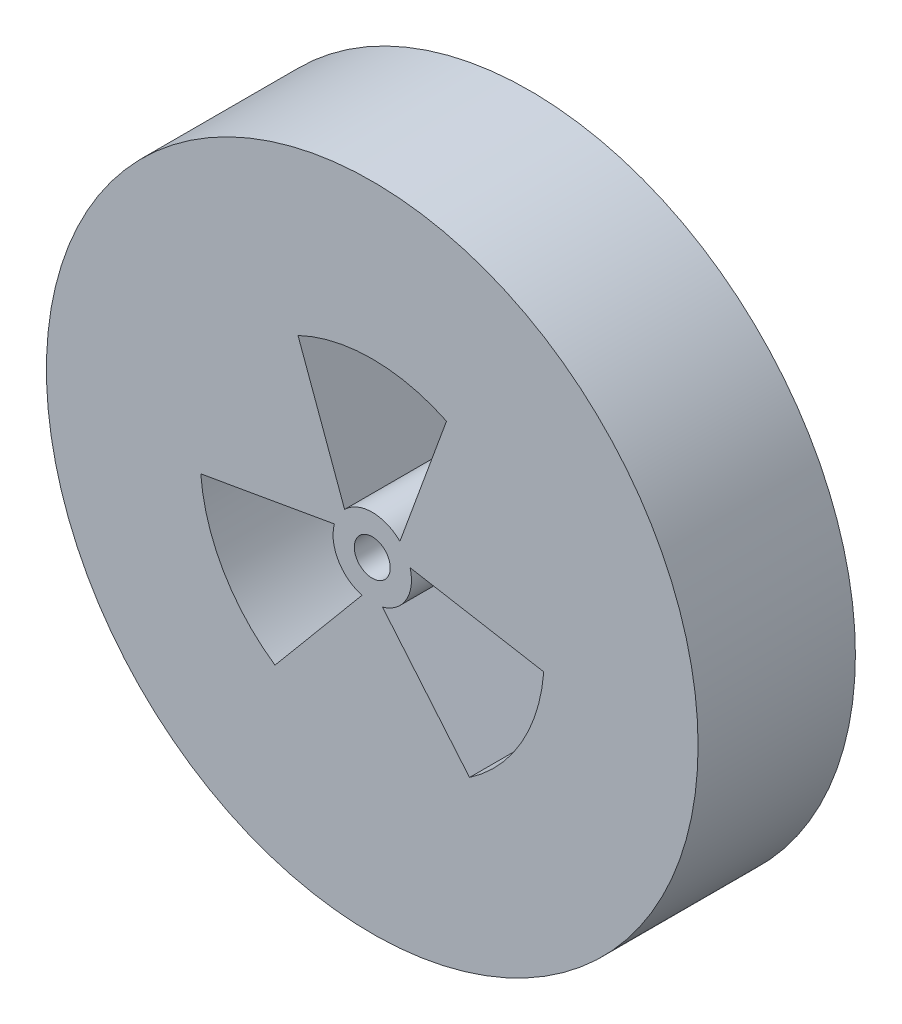
ISO-10303-21;
HEADER;
FILE_DESCRIPTION(('STEP AP214'),'2;1');
FILE_NAME('part.step','',(''),(''),'','','');
FILE_SCHEMA(('AUTOMOTIVE_DESIGN { 1 0 10303 214 1 1 1 1 }'));
ENDSEC;
DATA;
#1=APPLICATION_CONTEXT('core data for automotive mechanical design processes');
#2=APPLICATION_PROTOCOL_DEFINITION('international standard','automotive_design',2000,#1);
#3=PRODUCT_CONTEXT('',#1,'mechanical');
#4=PRODUCT('Part','Part','',(#3));
#5=PRODUCT_RELATED_PRODUCT_CATEGORY('part','',(#4));
#6=PRODUCT_DEFINITION_FORMATION('','',#4);
#7=PRODUCT_DEFINITION_CONTEXT('part definition',#1,'design');
#8=PRODUCT_DEFINITION('design','',#6,#7);
#9=PRODUCT_DEFINITION_SHAPE('','',#8);
#10=(LENGTH_UNIT() NAMED_UNIT(*) SI_UNIT(.MILLI.,.METRE.));
#11=(NAMED_UNIT(*) PLANE_ANGLE_UNIT() SI_UNIT($,.RADIAN.));
#12=(NAMED_UNIT(*) SI_UNIT($,.STERADIAN.) SOLID_ANGLE_UNIT());
#13=UNCERTAINTY_MEASURE_WITH_UNIT(LENGTH_MEASURE(1.E-05),#10,'distance_accuracy_value','');
#14=(GEOMETRIC_REPRESENTATION_CONTEXT(3) GLOBAL_UNCERTAINTY_ASSIGNED_CONTEXT((#13)) GLOBAL_UNIT_ASSIGNED_CONTEXT((#10,
#11,#12)) REPRESENTATION_CONTEXT('',''));
#15=CARTESIAN_POINT('',(0.,0.,0.));
#16=DIRECTION('',(0.,0.,1.));
#17=DIRECTION('',(1.,0.,0.));
#18=AXIS2_PLACEMENT_3D('',#15,#16,#17);
#19=CARTESIAN_POINT('',(0.,0.,35.));
#20=DIRECTION('',(0.,0.,1.));
#21=DIRECTION('',(1.,0.,0.));
#22=AXIS2_PLACEMENT_3D('',#19,#20,#21);
#23=PLANE('',#22);
#24=CARTESIAN_POINT('',(0.,0.,35.));
#25=DIRECTION('',(0.,0.,1.));
#26=DIRECTION('',(1.,0.,0.));
#27=AXIS2_PLACEMENT_3D('',#24,#25,#26);
#28=CIRCLE('',#27,72.5);
#29=CARTESIAN_POINT('',(72.5,0.,35.));
#30=VERTEX_POINT('',#29);
#31=EDGE_CURVE('E11',#30,#30,#28,.T.);
#32=ORIENTED_EDGE('',*,*,#31,.T.);
#33=EDGE_LOOP('',(#32));
#34=FACE_BOUND('',#33,.T.);
#35=CARTESIAN_POINT('',(0.,0.,35.));
#36=DIRECTION('',(0.,0.,1.));
#37=DIRECTION('',(1.,0.,0.));
#38=AXIS2_PLACEMENT_3D('',#35,#36,#37);
#39=CIRCLE('',#38,4.);
#40=CARTESIAN_POINT('',(4.,0.,35.));
#41=VERTEX_POINT('',#40);
#42=EDGE_CURVE('E120',#41,#41,#39,.T.);
#43=ORIENTED_EDGE('',*,*,#42,.F.);
#44=EDGE_LOOP('',(#43));
#45=FACE_BOUND('',#44,.T.);
#46=DIRECTION('',(-0.343414958043601,-0.939183776793398,0.));
#47=VECTOR('',#46,1.);
#48=CARTESIAN_POINT('',(6.15529830273519,6.18073022841704,35.));
#49=LINE('',#48,#47);
#50=CARTESIAN_POINT('',(16.5189630462717,34.5236592921516,35.));
#51=VERTEX_POINT('',#50);
#52=CARTESIAN_POINT('',(6.15529830273519,6.18073022841704,35.));
#53=VERTEX_POINT('',#52);
#54=EDGE_CURVE('E84',#51,#53,#49,.T.);
#55=ORIENTED_EDGE('',*,*,#54,.T.);
#56=CARTESIAN_POINT('',(0.,0.,35.));
#57=DIRECTION('',(0.,0.,-1.));
#58=DIRECTION('',(-1.,0.,0.));
#59=AXIS2_PLACEMENT_3D('',#56,#57,#58);
#60=CIRCLE('',#59,8.72290796421256);
#61=CARTESIAN_POINT('',(-6.15529830273519,6.18073022841704,35.));
#62=VERTEX_POINT('',#61);
#63=EDGE_CURVE('E86',#62,#53,#60,.T.);
#64=ORIENTED_EDGE('',*,*,#63,.F.);
#65=DIRECTION('',(0.343414958043601,-0.939183776793398,0.));
#66=VECTOR('',#65,1.);
#67=CARTESIAN_POINT('',(-6.15529830273519,6.18073022841704,35.));
#68=LINE('',#67,#66);
#69=CARTESIAN_POINT('',(-16.5189630462717,34.5236592921516,35.));
#70=VERTEX_POINT('',#69);
#71=EDGE_CURVE('E85',#70,#62,#68,.T.);
#72=ORIENTED_EDGE('',*,*,#71,.F.);
#73=CARTESIAN_POINT('',(0.,0.,35.));
#74=DIRECTION('',(0.,0.,1.));
#75=DIRECTION('',(-1.,0.,0.));
#76=AXIS2_PLACEMENT_3D('',#73,#74,#75);
#77=CIRCLE('',#76,38.2721725414779);
#78=EDGE_CURVE('E63',#51,#70,#77,.T.);
#79=ORIENTED_EDGE('',*,*,#78,.F.);
#80=EDGE_LOOP('',(#55,#64,#72,#79));
#81=FACE_BOUND('',#80,.T.);
#82=DIRECTION('',(-0.641649530503493,0.766997966102027,0.));
#83=VECTOR('',#82,1.);
#84=CARTESIAN_POINT('',(2.27502024037992,-8.42100981224845,35.));
#85=LINE('',#84,#83);
#86=CARTESIAN_POINT('',(21.638884455466,-31.5676712883235,35.));
#87=VERTEX_POINT('',#86);
#88=CARTESIAN_POINT('',(2.27502024037992,-8.42100981224845,35.));
#89=VERTEX_POINT('',#88);
#90=EDGE_CURVE('E202',#87,#89,#85,.T.);
#91=ORIENTED_EDGE('',*,*,#90,.T.);
#92=CARTESIAN_POINT('',(0.,0.,35.));
#93=DIRECTION('',(0.,0.,-1.));
#94=DIRECTION('',(0.500000000000004,0.866025403784436,0.));
#95=AXIS2_PLACEMENT_3D('',#92,#93,#94);
#96=CIRCLE('',#95,8.72290796421256);
#97=CARTESIAN_POINT('',(8.43031854311516,2.24027958383136,35.));
#98=VERTEX_POINT('',#97);
#99=EDGE_CURVE('E220',#98,#89,#96,.T.);
#100=ORIENTED_EDGE('',*,*,#99,.F.);
#101=DIRECTION('',(-0.985064488547097,0.172185810691379,0.));
#102=VECTOR('',#101,1.);
#103=CARTESIAN_POINT('',(8.43031854311516,2.24027958383136,35.));
#104=LINE('',#103,#102);
#105=CARTESIAN_POINT('',(38.1578475017378,-2.95598800382836,35.));
#106=VERTEX_POINT('',#105);
#107=EDGE_CURVE('E214',#106,#98,#104,.T.);
#108=ORIENTED_EDGE('',*,*,#107,.F.);
#109=CARTESIAN_POINT('',(0.,0.,35.));
#110=DIRECTION('',(0.,0.,1.));
#111=DIRECTION('',(0.500000000000004,0.866025403784436,0.));
#112=AXIS2_PLACEMENT_3D('',#109,#110,#111);
#113=CIRCLE('',#112,38.2721725414779);
#114=EDGE_CURVE('E223',#87,#106,#113,.T.);
#115=ORIENTED_EDGE('',*,*,#114,.F.);
#116=EDGE_LOOP('',(#91,#100,#108,#115));
#117=FACE_BOUND('',#116,.T.);
#118=DIRECTION('',(0.985064488547099,0.172185810691365,0.));
#119=VECTOR('',#118,1.);
#120=CARTESIAN_POINT('',(-8.43031854311513,2.24027958383147,35.));
#121=LINE('',#120,#119);
#122=CARTESIAN_POINT('',(-38.1578475017379,-2.95598800382782,35.));
#123=VERTEX_POINT('',#122);
#124=CARTESIAN_POINT('',(-8.43031854311513,2.24027958383147,35.));
#125=VERTEX_POINT('',#124);
#126=EDGE_CURVE('E188',#123,#125,#121,.T.);
#127=ORIENTED_EDGE('',*,*,#126,.T.);
#128=CARTESIAN_POINT('',(0.,0.,35.));
#129=DIRECTION('',(0.,0.,-1.));
#130=DIRECTION('',(0.499999999999992,-0.866025403784443,0.));
#131=AXIS2_PLACEMENT_3D('',#128,#129,#130);
#132=CIRCLE('',#131,8.72290796421256);
#133=CARTESIAN_POINT('',(-2.27502024038004,-8.42100981224842,35.));
#134=VERTEX_POINT('',#133);
#135=EDGE_CURVE('E193',#134,#125,#132,.T.);
#136=ORIENTED_EDGE('',*,*,#135,.F.);
#137=DIRECTION('',(0.641649530503504,0.766997966102018,0.));
#138=VECTOR('',#137,1.);
#139=CARTESIAN_POINT('',(-2.27502024038004,-8.42100981224842,35.));
#140=LINE('',#139,#138);
#141=CARTESIAN_POINT('',(-21.6388844554665,-31.5676712883232,35.));
#142=VERTEX_POINT('',#141);
#143=EDGE_CURVE('E176',#142,#134,#140,.T.);
#144=ORIENTED_EDGE('',*,*,#143,.F.);
#145=CARTESIAN_POINT('',(0.,0.,35.));
#146=DIRECTION('',(0.,0.,1.));
#147=DIRECTION('',(0.499999999999992,-0.866025403784443,0.));
#148=AXIS2_PLACEMENT_3D('',#145,#146,#147);
#149=CIRCLE('',#148,38.2721725414779);
#150=EDGE_CURVE('E235',#123,#142,#149,.T.);
#151=ORIENTED_EDGE('',*,*,#150,.F.);
#152=EDGE_LOOP('',(#127,#136,#144,#151));
#153=FACE_BOUND('',#152,.T.);
#154=ADVANCED_FACE('F34',(#34,#45,#81,#117,#153),#23,.T.);
#155=CARTESIAN_POINT('',(0.,0.,0.));
#156=DIRECTION('',(0.,0.,1.));
#157=DIRECTION('',(1.,0.,0.));
#158=AXIS2_PLACEMENT_3D('',#155,#156,#157);
#159=PLANE('',#158);
#160=CARTESIAN_POINT('',(0.,0.,0.));
#161=DIRECTION('',(0.,0.,-1.));
#162=DIRECTION('',(0.500000000000004,0.866025403784436,0.));
#163=AXIS2_PLACEMENT_3D('',#160,#161,#162);
#164=CIRCLE('',#163,8.72290796421256);
#165=CARTESIAN_POINT('',(8.43031854311516,2.24027958383136,0.));
#166=VERTEX_POINT('',#165);
#167=CARTESIAN_POINT('',(2.27502024037992,-8.42100981224845,0.));
#168=VERTEX_POINT('',#167);
#169=EDGE_CURVE('E210',#166,#168,#164,.T.);
#170=ORIENTED_EDGE('',*,*,#169,.T.);
#171=DIRECTION('',(-0.641649530503493,0.766997966102027,0.));
#172=VECTOR('',#171,1.);
#173=CARTESIAN_POINT('',(2.27502024037992,-8.42100981224845,0.));
#174=LINE('',#173,#172);
#175=CARTESIAN_POINT('',(21.638884455466,-31.5676712883235,0.));
#176=VERTEX_POINT('',#175);
#177=EDGE_CURVE('E198',#176,#168,#174,.T.);
#178=ORIENTED_EDGE('',*,*,#177,.F.);
#179=CARTESIAN_POINT('',(0.,0.,0.));
#180=DIRECTION('',(0.,0.,1.));
#181=DIRECTION('',(0.500000000000004,0.866025403784436,0.));
#182=AXIS2_PLACEMENT_3D('',#179,#180,#181);
#183=CIRCLE('',#182,38.2721725414779);
#184=CARTESIAN_POINT('',(38.1578475017378,-2.95598800382836,0.));
#185=VERTEX_POINT('',#184);
#186=EDGE_CURVE('E213',#176,#185,#183,.T.);
#187=ORIENTED_EDGE('',*,*,#186,.T.);
#188=DIRECTION('',(-0.985064488547097,0.172185810691379,0.));
#189=VECTOR('',#188,1.);
#190=CARTESIAN_POINT('',(8.43031854311516,2.24027958383136,0.));
#191=LINE('',#190,#189);
#192=EDGE_CURVE('E217',#185,#166,#191,.T.);
#193=ORIENTED_EDGE('',*,*,#192,.T.);
#194=EDGE_LOOP('',(#170,#178,#187,#193));
#195=FACE_BOUND('',#194,.T.);
#196=CARTESIAN_POINT('',(0.,0.,0.));
#197=DIRECTION('',(0.,0.,1.));
#198=DIRECTION('',(1.,0.,0.));
#199=AXIS2_PLACEMENT_3D('',#196,#197,#198);
#200=CIRCLE('',#199,4.);
#201=CARTESIAN_POINT('',(4.,0.,0.));
#202=VERTEX_POINT('',#201);
#203=EDGE_CURVE('E118',#202,#202,#200,.T.);
#204=ORIENTED_EDGE('',*,*,#203,.T.);
#205=EDGE_LOOP('',(#204));
#206=FACE_BOUND('',#205,.T.);
#207=CARTESIAN_POINT('',(0.,0.,0.));
#208=DIRECTION('',(0.,0.,1.));
#209=DIRECTION('',(1.,0.,0.));
#210=AXIS2_PLACEMENT_3D('',#207,#208,#209);
#211=CIRCLE('',#210,72.5);
#212=CARTESIAN_POINT('',(72.5,0.,0.));
#213=VERTEX_POINT('',#212);
#214=EDGE_CURVE('E38',#213,#213,#211,.T.);
#215=ORIENTED_EDGE('',*,*,#214,.F.);
#216=EDGE_LOOP('',(#215));
#217=FACE_BOUND('',#216,.T.);
#218=CARTESIAN_POINT('',(0.,0.,0.));
#219=DIRECTION('',(0.,0.,-1.));
#220=DIRECTION('',(-1.,0.,0.));
#221=AXIS2_PLACEMENT_3D('',#218,#219,#220);
#222=CIRCLE('',#221,8.72290796421256);
#223=CARTESIAN_POINT('',(-6.15529830273519,6.18073022841704,0.));
#224=VERTEX_POINT('',#223);
#225=CARTESIAN_POINT('',(6.15529830273519,6.18073022841704,0.));
#226=VERTEX_POINT('',#225);
#227=EDGE_CURVE('E108',#224,#226,#222,.T.);
#228=ORIENTED_EDGE('',*,*,#227,.T.);
#229=DIRECTION('',(-0.343414958043601,-0.939183776793398,0.));
#230=VECTOR('',#229,1.);
#231=CARTESIAN_POINT('',(6.15529830273519,6.18073022841704,0.));
#232=LINE('',#231,#230);
#233=CARTESIAN_POINT('',(16.5189630462717,34.5236592921516,0.));
#234=VERTEX_POINT('',#233);
#235=EDGE_CURVE('E98',#234,#226,#232,.T.);
#236=ORIENTED_EDGE('',*,*,#235,.F.);
#237=CARTESIAN_POINT('',(0.,0.,0.));
#238=DIRECTION('',(0.,0.,1.));
#239=DIRECTION('',(-1.,0.,0.));
#240=AXIS2_PLACEMENT_3D('',#237,#238,#239);
#241=CIRCLE('',#240,38.2721725414779);
#242=CARTESIAN_POINT('',(-16.5189630462717,34.5236592921516,0.));
#243=VERTEX_POINT('',#242);
#244=EDGE_CURVE('E68',#234,#243,#241,.T.);
#245=ORIENTED_EDGE('',*,*,#244,.T.);
#246=DIRECTION('',(0.343414958043601,-0.939183776793398,0.));
#247=VECTOR('',#246,1.);
#248=CARTESIAN_POINT('',(-6.15529830273519,6.18073022841704,0.));
#249=LINE('',#248,#247);
#250=EDGE_CURVE('E111',#243,#224,#249,.T.);
#251=ORIENTED_EDGE('',*,*,#250,.T.);
#252=EDGE_LOOP('',(#228,#236,#245,#251));
#253=FACE_BOUND('',#252,.T.);
#254=CARTESIAN_POINT('',(0.,0.,0.));
#255=DIRECTION('',(0.,0.,-1.));
#256=DIRECTION('',(0.499999999999992,-0.866025403784443,0.));
#257=AXIS2_PLACEMENT_3D('',#254,#255,#256);
#258=CIRCLE('',#257,8.72290796421256);
#259=CARTESIAN_POINT('',(-2.27502024038004,-8.42100981224842,0.));
#260=VERTEX_POINT('',#259);
#261=CARTESIAN_POINT('',(-8.43031854311513,2.24027958383147,0.));
#262=VERTEX_POINT('',#261);
#263=EDGE_CURVE('E162',#260,#262,#258,.T.);
#264=ORIENTED_EDGE('',*,*,#263,.T.);
#265=DIRECTION('',(0.985064488547099,0.172185810691365,0.));
#266=VECTOR('',#265,1.);
#267=CARTESIAN_POINT('',(-8.43031854311513,2.24027958383147,0.));
#268=LINE('',#267,#266);
#269=CARTESIAN_POINT('',(-38.1578475017379,-2.95598800382782,0.));
#270=VERTEX_POINT('',#269);
#271=EDGE_CURVE('E166',#270,#262,#268,.T.);
#272=ORIENTED_EDGE('',*,*,#271,.F.);
#273=CARTESIAN_POINT('',(0.,0.,0.));
#274=DIRECTION('',(0.,0.,1.));
#275=DIRECTION('',(0.499999999999992,-0.866025403784443,0.));
#276=AXIS2_PLACEMENT_3D('',#273,#274,#275);
#277=CIRCLE('',#276,38.2721725414779);
#278=CARTESIAN_POINT('',(-21.6388844554665,-31.5676712883232,0.));
#279=VERTEX_POINT('',#278);
#280=EDGE_CURVE('E175',#270,#279,#277,.T.);
#281=ORIENTED_EDGE('',*,*,#280,.T.);
#282=DIRECTION('',(0.641649530503504,0.766997966102018,0.));
#283=VECTOR('',#282,1.);
#284=CARTESIAN_POINT('',(-2.27502024038004,-8.42100981224842,0.));
#285=LINE('',#284,#283);
#286=EDGE_CURVE('E169',#279,#260,#285,.T.);
#287=ORIENTED_EDGE('',*,*,#286,.T.);
#288=EDGE_LOOP('',(#264,#272,#281,#287));
#289=FACE_BOUND('',#288,.T.);
#290=ADVANCED_FACE('F126',(#195,#206,#217,#253,#289),#159,.F.);
#291=CARTESIAN_POINT('',(0.,0.,35.));
#292=DIRECTION('',(0.,0.,-1.));
#293=DIRECTION('',(-1.,0.,0.));
#294=AXIS2_PLACEMENT_3D('',#291,#292,#293);
#295=CYLINDRICAL_SURFACE('',#294,72.5);
#296=ORIENTED_EDGE('',*,*,#31,.F.);
#297=EDGE_LOOP('',(#296));
#298=FACE_BOUND('',#297,.T.);
#299=ORIENTED_EDGE('',*,*,#214,.T.);
#300=EDGE_LOOP('',(#299));
#301=FACE_BOUND('',#300,.T.);
#302=ADVANCED_FACE('F36',(#298,#301),#295,.T.);
#303=CARTESIAN_POINT('',(0.,0.,35.));
#304=DIRECTION('',(0.,0.,-1.));
#305=DIRECTION('',(-1.,0.,0.));
#306=AXIS2_PLACEMENT_3D('',#303,#304,#305);
#307=CYLINDRICAL_SURFACE('',#306,4.);
#308=ORIENTED_EDGE('',*,*,#42,.T.);
#309=EDGE_LOOP('',(#308));
#310=FACE_BOUND('',#309,.T.);
#311=ORIENTED_EDGE('',*,*,#203,.F.);
#312=EDGE_LOOP('',(#311));
#313=FACE_BOUND('',#312,.T.);
#314=ADVANCED_FACE('F129',(#310,#313),#307,.F.);
#315=CARTESIAN_POINT('',(0.,0.,0.));
#316=DIRECTION('',(0.,0.,1.));
#317=DIRECTION('',(1.,0.,0.));
#318=AXIS2_PLACEMENT_3D('',#315,#316,#317);
#319=CYLINDRICAL_SURFACE('',#318,8.72290796421256);
#320=DIRECTION('',(0.,0.,1.));
#321=VECTOR('',#320,1.);
#322=CARTESIAN_POINT('',(6.15529830273519,6.18073022841704,0.));
#323=LINE('',#322,#321);
#324=EDGE_CURVE('E93',#226,#53,#323,.T.);
#325=ORIENTED_EDGE('',*,*,#324,.F.);
#326=ORIENTED_EDGE('',*,*,#227,.F.);
#327=DIRECTION('',(0.,0.,1.));
#328=VECTOR('',#327,1.);
#329=CARTESIAN_POINT('',(-6.15529830273519,6.18073022841704,0.));
#330=LINE('',#329,#328);
#331=EDGE_CURVE('E51',#224,#62,#330,.T.);
#332=ORIENTED_EDGE('',*,*,#331,.T.);
#333=ORIENTED_EDGE('',*,*,#63,.T.);
#334=EDGE_LOOP('',(#325,#326,#332,#333));
#335=FACE_BOUND('',#334,.T.);
#336=ADVANCED_FACE('F131',(#335),#319,.T.);
#337=CARTESIAN_POINT('',(-6.15529830273519,6.18073022841704,0.));
#338=DIRECTION('',(-0.939183776793398,-0.343414958043601,0.));
#339=DIRECTION('',(0.343414958043601,-0.939183776793398,0.));
#340=AXIS2_PLACEMENT_3D('',#337,#338,#339);
#341=PLANE('',#340);
#342=ORIENTED_EDGE('',*,*,#71,.T.);
#343=ORIENTED_EDGE('',*,*,#331,.F.);
#344=ORIENTED_EDGE('',*,*,#250,.F.);
#345=DIRECTION('',(0.,0.,1.));
#346=VECTOR('',#345,1.);
#347=CARTESIAN_POINT('',(-16.5189630462717,34.5236592921516,0.));
#348=LINE('',#347,#346);
#349=EDGE_CURVE('E114',#243,#70,#348,.T.);
#350=ORIENTED_EDGE('',*,*,#349,.T.);
#351=EDGE_LOOP('',(#342,#343,#344,#350));
#352=FACE_BOUND('',#351,.T.);
#353=ADVANCED_FACE('F138',(#352),#341,.F.);
#354=CARTESIAN_POINT('',(0.,0.,0.));
#355=DIRECTION('',(0.,0.,1.));
#356=DIRECTION('',(1.,0.,0.));
#357=AXIS2_PLACEMENT_3D('',#354,#355,#356);
#358=CYLINDRICAL_SURFACE('',#357,38.2721725414779);
#359=ORIENTED_EDGE('',*,*,#78,.T.);
#360=ORIENTED_EDGE('',*,*,#349,.F.);
#361=ORIENTED_EDGE('',*,*,#244,.F.);
#362=DIRECTION('',(0.,0.,1.));
#363=VECTOR('',#362,1.);
#364=CARTESIAN_POINT('',(16.5189630462717,34.5236592921516,0.));
#365=LINE('',#364,#363);
#366=EDGE_CURVE('E88',#234,#51,#365,.T.);
#367=ORIENTED_EDGE('',*,*,#366,.T.);
#368=EDGE_LOOP('',(#359,#360,#361,#367));
#369=FACE_BOUND('',#368,.T.);
#370=ADVANCED_FACE('F89',(#369),#358,.F.);
#371=CARTESIAN_POINT('',(6.15529830273519,6.18073022841704,0.));
#372=DIRECTION('',(-0.939183776793398,0.343414958043601,0.));
#373=DIRECTION('',(-0.343414958043601,-0.939183776793398,0.));
#374=AXIS2_PLACEMENT_3D('',#371,#372,#373);
#375=PLANE('',#374);
#376=ORIENTED_EDGE('',*,*,#54,.F.);
#377=ORIENTED_EDGE('',*,*,#366,.F.);
#378=ORIENTED_EDGE('',*,*,#235,.T.);
#379=ORIENTED_EDGE('',*,*,#324,.T.);
#380=EDGE_LOOP('',(#376,#377,#378,#379));
#381=FACE_BOUND('',#380,.T.);
#382=ADVANCED_FACE('F96',(#381),#375,.T.);
#383=CARTESIAN_POINT('',(0.,0.,0.));
#384=DIRECTION('',(0.,0.,1.));
#385=DIRECTION('',(1.,0.,0.));
#386=AXIS2_PLACEMENT_3D('',#383,#384,#385);
#387=CYLINDRICAL_SURFACE('',#386,8.72290796421256);
#388=ORIENTED_EDGE('',*,*,#135,.T.);
#389=DIRECTION('',(0.,0.,1.));
#390=VECTOR('',#389,1.);
#391=CARTESIAN_POINT('',(-8.43031854311513,2.24027958383147,0.));
#392=LINE('',#391,#390);
#393=EDGE_CURVE('E184',#262,#125,#392,.T.);
#394=ORIENTED_EDGE('',*,*,#393,.F.);
#395=ORIENTED_EDGE('',*,*,#263,.F.);
#396=DIRECTION('',(0.,0.,1.));
#397=VECTOR('',#396,1.);
#398=CARTESIAN_POINT('',(-2.27502024038004,-8.42100981224842,0.));
#399=LINE('',#398,#397);
#400=EDGE_CURVE('E224',#260,#134,#399,.T.);
#401=ORIENTED_EDGE('',*,*,#400,.T.);
#402=EDGE_LOOP('',(#388,#394,#395,#401));
#403=FACE_BOUND('',#402,.T.);
#404=ADVANCED_FACE('F191',(#403),#387,.T.);
#405=CARTESIAN_POINT('',(-2.27502024038004,-8.42100981224842,0.));
#406=DIRECTION('',(0.766997966102019,-0.641649530503504,0.));
#407=DIRECTION('',(0.641649530503504,0.766997966102019,0.));
#408=AXIS2_PLACEMENT_3D('',#405,#406,#407);
#409=PLANE('',#408);
#410=ORIENTED_EDGE('',*,*,#143,.T.);
#411=ORIENTED_EDGE('',*,*,#400,.F.);
#412=ORIENTED_EDGE('',*,*,#286,.F.);
#413=DIRECTION('',(0.,0.,1.));
#414=VECTOR('',#413,1.);
#415=CARTESIAN_POINT('',(-21.6388844554665,-31.5676712883232,0.));
#416=LINE('',#415,#414);
#417=EDGE_CURVE('E233',#279,#142,#416,.T.);
#418=ORIENTED_EDGE('',*,*,#417,.T.);
#419=EDGE_LOOP('',(#410,#411,#412,#418));
#420=FACE_BOUND('',#419,.T.);
#421=ADVANCED_FACE('F244',(#420),#409,.F.);
#422=CARTESIAN_POINT('',(0.,0.,0.));
#423=DIRECTION('',(0.,0.,1.));
#424=DIRECTION('',(1.,0.,0.));
#425=AXIS2_PLACEMENT_3D('',#422,#423,#424);
#426=CYLINDRICAL_SURFACE('',#425,38.2721725414779);
#427=ORIENTED_EDGE('',*,*,#150,.T.);
#428=ORIENTED_EDGE('',*,*,#417,.F.);
#429=ORIENTED_EDGE('',*,*,#280,.F.);
#430=DIRECTION('',(0.,0.,1.));
#431=VECTOR('',#430,1.);
#432=CARTESIAN_POINT('',(-38.1578475017379,-2.95598800382782,0.));
#433=LINE('',#432,#431);
#434=EDGE_CURVE('E187',#270,#123,#433,.T.);
#435=ORIENTED_EDGE('',*,*,#434,.T.);
#436=EDGE_LOOP('',(#427,#428,#429,#435));
#437=FACE_BOUND('',#436,.T.);
#438=ADVANCED_FACE('F253',(#437),#426,.F.);
#439=CARTESIAN_POINT('',(0.,0.,0.));
#440=DIRECTION('',(0.,0.,1.));
#441=DIRECTION('',(1.,0.,0.));
#442=AXIS2_PLACEMENT_3D('',#439,#440,#441);
#443=CYLINDRICAL_SURFACE('',#442,8.72290796421256);
#444=ORIENTED_EDGE('',*,*,#99,.T.);
#445=DIRECTION('',(0.,0.,1.));
#446=VECTOR('',#445,1.);
#447=CARTESIAN_POINT('',(2.27502024037992,-8.42100981224845,0.));
#448=LINE('',#447,#446);
#449=EDGE_CURVE('E201',#168,#89,#448,.T.);
#450=ORIENTED_EDGE('',*,*,#449,.F.);
#451=ORIENTED_EDGE('',*,*,#169,.F.);
#452=DIRECTION('',(0.,0.,1.));
#453=VECTOR('',#452,1.);
#454=CARTESIAN_POINT('',(8.43031854311516,2.24027958383136,0.));
#455=LINE('',#454,#453);
#456=EDGE_CURVE('E99',#166,#98,#455,.T.);
#457=ORIENTED_EDGE('',*,*,#456,.T.);
#458=EDGE_LOOP('',(#444,#450,#451,#457));
#459=FACE_BOUND('',#458,.T.);
#460=ADVANCED_FACE('F288',(#459),#443,.T.);
#461=CARTESIAN_POINT('',(8.43031854311516,2.24027958383136,0.));
#462=DIRECTION('',(0.172185810691379,0.985064488547096,0.));
#463=DIRECTION('',(-0.985064488547096,0.172185810691379,0.));
#464=AXIS2_PLACEMENT_3D('',#461,#462,#463);
#465=PLANE('',#464);
#466=ORIENTED_EDGE('',*,*,#107,.T.);
#467=ORIENTED_EDGE('',*,*,#456,.F.);
#468=ORIENTED_EDGE('',*,*,#192,.F.);
#469=DIRECTION('',(0.,0.,1.));
#470=VECTOR('',#469,1.);
#471=CARTESIAN_POINT('',(38.1578475017378,-2.95598800382836,0.));
#472=LINE('',#471,#470);
#473=EDGE_CURVE('E103',#185,#106,#472,.T.);
#474=ORIENTED_EDGE('',*,*,#473,.T.);
#475=EDGE_LOOP('',(#466,#467,#468,#474));
#476=FACE_BOUND('',#475,.T.);
#477=ADVANCED_FACE('F294',(#476),#465,.F.);
#478=CARTESIAN_POINT('',(0.,0.,0.));
#479=DIRECTION('',(0.,0.,1.));
#480=DIRECTION('',(1.,0.,0.));
#481=AXIS2_PLACEMENT_3D('',#478,#479,#480);
#482=CYLINDRICAL_SURFACE('',#481,38.2721725414779);
#483=ORIENTED_EDGE('',*,*,#114,.T.);
#484=ORIENTED_EDGE('',*,*,#473,.F.);
#485=ORIENTED_EDGE('',*,*,#186,.F.);
#486=DIRECTION('',(0.,0.,1.));
#487=VECTOR('',#486,1.);
#488=CARTESIAN_POINT('',(21.638884455466,-31.5676712883235,0.));
#489=LINE('',#488,#487);
#490=EDGE_CURVE('E205',#176,#87,#489,.T.);
#491=ORIENTED_EDGE('',*,*,#490,.T.);
#492=EDGE_LOOP('',(#483,#484,#485,#491));
#493=FACE_BOUND('',#492,.T.);
#494=ADVANCED_FACE('F292',(#493),#482,.F.);
#495=CARTESIAN_POINT('',(2.27502024037992,-8.42100981224845,0.));
#496=DIRECTION('',(0.766997966102028,0.641649530503493,0.));
#497=DIRECTION('',(-0.641649530503493,0.766997966102028,0.));
#498=AXIS2_PLACEMENT_3D('',#495,#496,#497);
#499=PLANE('',#498);
#500=ORIENTED_EDGE('',*,*,#90,.F.);
#501=ORIENTED_EDGE('',*,*,#490,.F.);
#502=ORIENTED_EDGE('',*,*,#177,.T.);
#503=ORIENTED_EDGE('',*,*,#449,.T.);
#504=EDGE_LOOP('',(#500,#501,#502,#503));
#505=FACE_BOUND('',#504,.T.);
#506=ADVANCED_FACE('F287',(#505),#499,.T.);
#507=CARTESIAN_POINT('',(-8.43031854311513,2.24027958383147,0.));
#508=DIRECTION('',(0.172185810691365,-0.985064488547099,0.));
#509=DIRECTION('',(0.985064488547099,0.172185810691365,0.));
#510=AXIS2_PLACEMENT_3D('',#507,#508,#509);
#511=PLANE('',#510);
#512=ORIENTED_EDGE('',*,*,#126,.F.);
#513=ORIENTED_EDGE('',*,*,#434,.F.);
#514=ORIENTED_EDGE('',*,*,#271,.T.);
#515=ORIENTED_EDGE('',*,*,#393,.T.);
#516=EDGE_LOOP('',(#512,#513,#514,#515));
#517=FACE_BOUND('',#516,.T.);
#518=ADVANCED_FACE('F182',(#517),#511,.T.);
#519=CLOSED_SHELL('',(#154,#290,#302,#314,#336,#353,#370,#382,#404,#421,#438,#460,#477,#494,
#506,#518));
#520=MANIFOLD_SOLID_BREP('B2',#519);
#521=ADVANCED_BREP_SHAPE_REPRESENTATION('',(#18,#520),#14);
#522=SHAPE_DEFINITION_REPRESENTATION(#9,#521);
ENDSEC;
END-ISO-10303-21;
